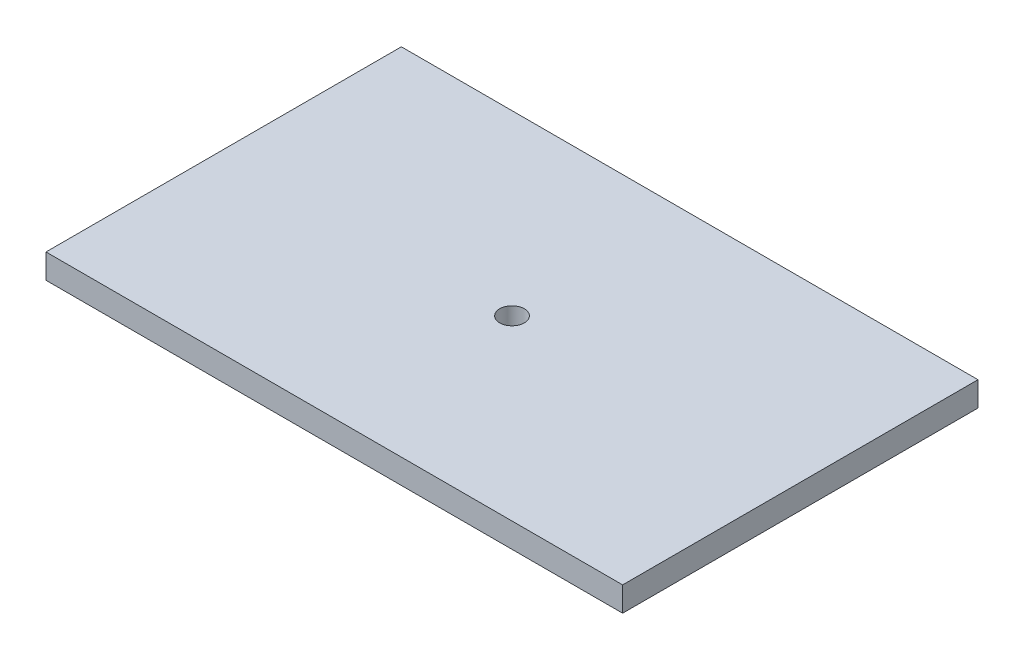
ISO-10303-21;
HEADER;
FILE_DESCRIPTION(('STEP AP214'),'2;1');
FILE_NAME('part.step','',(''),(''),'','','');
FILE_SCHEMA(('AUTOMOTIVE_DESIGN { 1 0 10303 214 1 1 1 1 }'));
ENDSEC;
DATA;
#1=APPLICATION_CONTEXT('core data for automotive mechanical design processes');
#2=APPLICATION_PROTOCOL_DEFINITION('international standard','automotive_design',2000,#1);
#3=PRODUCT_CONTEXT('',#1,'mechanical');
#4=PRODUCT('Part','Part','',(#3));
#5=PRODUCT_RELATED_PRODUCT_CATEGORY('part','',(#4));
#6=PRODUCT_DEFINITION_FORMATION('','',#4);
#7=PRODUCT_DEFINITION_CONTEXT('part definition',#1,'design');
#8=PRODUCT_DEFINITION('design','',#6,#7);
#9=PRODUCT_DEFINITION_SHAPE('','',#8);
#10=(LENGTH_UNIT() NAMED_UNIT(*) SI_UNIT(.MILLI.,.METRE.));
#11=(NAMED_UNIT(*) PLANE_ANGLE_UNIT() SI_UNIT($,.RADIAN.));
#12=(NAMED_UNIT(*) SI_UNIT($,.STERADIAN.) SOLID_ANGLE_UNIT());
#13=UNCERTAINTY_MEASURE_WITH_UNIT(LENGTH_MEASURE(1.E-05),#10,'distance_accuracy_value','');
#14=(GEOMETRIC_REPRESENTATION_CONTEXT(3) GLOBAL_UNCERTAINTY_ASSIGNED_CONTEXT((#13)) GLOBAL_UNIT_ASSIGNED_CONTEXT((#10,
#11,#12)) REPRESENTATION_CONTEXT('',''));
#15=CARTESIAN_POINT('',(0.,0.,0.));
#16=DIRECTION('',(0.,0.,1.));
#17=DIRECTION('',(1.,0.,0.));
#18=AXIS2_PLACEMENT_3D('',#15,#16,#17);
#19=CARTESIAN_POINT('',(117.401060525338,10.,-72.3518163702665));
#20=DIRECTION('',(-1.,0.,0.));
#21=DIRECTION('',(0.,0.,1.));
#22=AXIS2_PLACEMENT_3D('',#19,#20,#21);
#23=PLANE('',#22);
#24=DIRECTION('',(0.,0.,-1.));
#25=VECTOR('',#24,1.);
#26=CARTESIAN_POINT('',(117.401060525338,0.,-72.3518163702665));
#27=LINE('',#26,#25);
#28=CARTESIAN_POINT('',(117.401060525338,0.,72.3518163702665));
#29=VERTEX_POINT('',#28);
#30=CARTESIAN_POINT('',(117.401060525338,0.,-72.3518163702665));
#31=VERTEX_POINT('',#30);
#32=EDGE_CURVE('E96',#29,#31,#27,.T.);
#33=ORIENTED_EDGE('',*,*,#32,.T.);
#34=DIRECTION('',(0.,-1.,0.));
#35=VECTOR('',#34,1.);
#36=CARTESIAN_POINT('',(117.401060525338,10.,-72.3518163702665));
#37=LINE('',#36,#35);
#38=CARTESIAN_POINT('',(117.401060525338,10.,-72.3518163702665));
#39=VERTEX_POINT('',#38);
#40=EDGE_CURVE('E11',#39,#31,#37,.T.);
#41=ORIENTED_EDGE('',*,*,#40,.F.);
#42=DIRECTION('',(0.,0.,-1.));
#43=VECTOR('',#42,1.);
#44=CARTESIAN_POINT('',(117.401060525338,10.,-72.3518163702665));
#45=LINE('',#44,#43);
#46=CARTESIAN_POINT('',(117.401060525338,10.,72.3518163702665));
#47=VERTEX_POINT('',#46);
#48=EDGE_CURVE('E84',#47,#39,#45,.T.);
#49=ORIENTED_EDGE('',*,*,#48,.F.);
#50=DIRECTION('',(0.,-1.,0.));
#51=VECTOR('',#50,1.);
#52=CARTESIAN_POINT('',(117.401060525338,10.,72.3518163702665));
#53=LINE('',#52,#51);
#54=EDGE_CURVE('E92',#47,#29,#53,.T.);
#55=ORIENTED_EDGE('',*,*,#54,.T.);
#56=EDGE_LOOP('',(#33,#41,#49,#55));
#57=FACE_BOUND('',#56,.T.);
#58=ADVANCED_FACE('F33',(#57),#23,.F.);
#59=CARTESIAN_POINT('',(-117.401060525338,10.,-72.3518163702665));
#60=DIRECTION('',(0.,0.,1.));
#61=DIRECTION('',(1.,0.,0.));
#62=AXIS2_PLACEMENT_3D('',#59,#60,#61);
#63=PLANE('',#62);
#64=DIRECTION('',(-1.,0.,0.));
#65=VECTOR('',#64,1.);
#66=CARTESIAN_POINT('',(-117.401060525338,0.,-72.3518163702665));
#67=LINE('',#66,#65);
#68=CARTESIAN_POINT('',(-117.401060525338,0.,-72.3518163702665));
#69=VERTEX_POINT('',#68);
#70=EDGE_CURVE('E88',#31,#69,#67,.T.);
#71=ORIENTED_EDGE('',*,*,#70,.T.);
#72=DIRECTION('',(0.,-1.,0.));
#73=VECTOR('',#72,1.);
#74=CARTESIAN_POINT('',(-117.401060525338,10.,-72.3518163702665));
#75=LINE('',#74,#73);
#76=CARTESIAN_POINT('',(-117.401060525338,10.,-72.3518163702665));
#77=VERTEX_POINT('',#76);
#78=EDGE_CURVE('E41',#77,#69,#75,.T.);
#79=ORIENTED_EDGE('',*,*,#78,.F.);
#80=DIRECTION('',(-1.,0.,0.));
#81=VECTOR('',#80,1.);
#82=CARTESIAN_POINT('',(-117.401060525338,10.,-72.3518163702665));
#83=LINE('',#82,#81);
#84=EDGE_CURVE('E79',#39,#77,#83,.T.);
#85=ORIENTED_EDGE('',*,*,#84,.F.);
#86=ORIENTED_EDGE('',*,*,#40,.T.);
#87=EDGE_LOOP('',(#71,#79,#85,#86));
#88=FACE_BOUND('',#87,.T.);
#89=ADVANCED_FACE('F87',(#88),#63,.F.);
#90=CARTESIAN_POINT('',(-117.401060525338,10.,-72.3518163702665));
#91=DIRECTION('',(1.,0.,0.));
#92=DIRECTION('',(0.,0.,-1.));
#93=AXIS2_PLACEMENT_3D('',#90,#91,#92);
#94=PLANE('',#93);
#95=DIRECTION('',(0.,0.,1.));
#96=VECTOR('',#95,1.);
#97=CARTESIAN_POINT('',(-117.401060525338,0.,-72.3518163702665));
#98=LINE('',#97,#96);
#99=CARTESIAN_POINT('',(-117.401060525338,0.,72.3518163702665));
#100=VERTEX_POINT('',#99);
#101=EDGE_CURVE('E66',#69,#100,#98,.T.);
#102=ORIENTED_EDGE('',*,*,#101,.T.);
#103=DIRECTION('',(0.,-1.,0.));
#104=VECTOR('',#103,1.);
#105=CARTESIAN_POINT('',(-117.401060525338,10.,72.3518163702665));
#106=LINE('',#105,#104);
#107=CARTESIAN_POINT('',(-117.401060525338,10.,72.3518163702665));
#108=VERTEX_POINT('',#107);
#109=EDGE_CURVE('E89',#108,#100,#106,.T.);
#110=ORIENTED_EDGE('',*,*,#109,.F.);
#111=DIRECTION('',(0.,0.,1.));
#112=VECTOR('',#111,1.);
#113=CARTESIAN_POINT('',(-117.401060525338,10.,-72.3518163702665));
#114=LINE('',#113,#112);
#115=EDGE_CURVE('E82',#77,#108,#114,.T.);
#116=ORIENTED_EDGE('',*,*,#115,.F.);
#117=ORIENTED_EDGE('',*,*,#78,.T.);
#118=EDGE_LOOP('',(#102,#110,#116,#117));
#119=FACE_BOUND('',#118,.T.);
#120=ADVANCED_FACE('F90',(#119),#94,.F.);
#121=CARTESIAN_POINT('',(-117.401060525338,10.,72.3518163702665));
#122=DIRECTION('',(0.,0.,-1.));
#123=DIRECTION('',(-1.,0.,0.));
#124=AXIS2_PLACEMENT_3D('',#121,#122,#123);
#125=PLANE('',#124);
#126=DIRECTION('',(1.,0.,0.));
#127=VECTOR('',#126,1.);
#128=CARTESIAN_POINT('',(-117.401060525338,0.,72.3518163702665));
#129=LINE('',#128,#127);
#130=EDGE_CURVE('E72',#100,#29,#129,.T.);
#131=ORIENTED_EDGE('',*,*,#130,.T.);
#132=ORIENTED_EDGE('',*,*,#54,.F.);
#133=DIRECTION('',(1.,0.,0.));
#134=VECTOR('',#133,1.);
#135=CARTESIAN_POINT('',(-117.401060525338,10.,72.3518163702665));
#136=LINE('',#135,#134);
#137=EDGE_CURVE('E49',#108,#47,#136,.T.);
#138=ORIENTED_EDGE('',*,*,#137,.F.);
#139=ORIENTED_EDGE('',*,*,#109,.T.);
#140=EDGE_LOOP('',(#131,#132,#138,#139));
#141=FACE_BOUND('',#140,.T.);
#142=ADVANCED_FACE('F104',(#141),#125,.F.);
#143=CARTESIAN_POINT('',(0.,10.,0.));
#144=DIRECTION('',(0.,1.,0.));
#145=DIRECTION('',(0.,0.,1.));
#146=AXIS2_PLACEMENT_3D('',#143,#144,#145);
#147=PLANE('',#146);
#148=CARTESIAN_POINT('',(0.,10.,0.));
#149=DIRECTION('',(0.,1.,0.));
#150=DIRECTION('',(0.,0.,1.));
#151=AXIS2_PLACEMENT_3D('',#148,#149,#150);
#152=CIRCLE('',#151,5.);
#153=CARTESIAN_POINT('',(0.,10.,5.));
#154=VERTEX_POINT('',#153);
#155=EDGE_CURVE('E110',#154,#154,#152,.T.);
#156=ORIENTED_EDGE('',*,*,#155,.F.);
#157=EDGE_LOOP('',(#156));
#158=FACE_BOUND('',#157,.T.);
#159=ORIENTED_EDGE('',*,*,#48,.T.);
#160=ORIENTED_EDGE('',*,*,#84,.T.);
#161=ORIENTED_EDGE('',*,*,#115,.T.);
#162=ORIENTED_EDGE('',*,*,#137,.T.);
#163=EDGE_LOOP('',(#159,#160,#161,#162));
#164=FACE_BOUND('',#163,.T.);
#165=ADVANCED_FACE('F80',(#158,#164),#147,.T.);
#166=CARTESIAN_POINT('',(0.,0.,0.));
#167=DIRECTION('',(0.,1.,0.));
#168=DIRECTION('',(0.,0.,1.));
#169=AXIS2_PLACEMENT_3D('',#166,#167,#168);
#170=PLANE('',#169);
#171=CARTESIAN_POINT('',(0.,0.,0.));
#172=DIRECTION('',(0.,1.,0.));
#173=DIRECTION('',(0.,0.,1.));
#174=AXIS2_PLACEMENT_3D('',#171,#172,#173);
#175=CIRCLE('',#174,5.);
#176=CARTESIAN_POINT('',(0.,0.,5.));
#177=VERTEX_POINT('',#176);
#178=EDGE_CURVE('E99',#177,#177,#175,.T.);
#179=ORIENTED_EDGE('',*,*,#178,.T.);
#180=EDGE_LOOP('',(#179));
#181=FACE_BOUND('',#180,.T.);
#182=ORIENTED_EDGE('',*,*,#32,.F.);
#183=ORIENTED_EDGE('',*,*,#130,.F.);
#184=ORIENTED_EDGE('',*,*,#101,.F.);
#185=ORIENTED_EDGE('',*,*,#70,.F.);
#186=EDGE_LOOP('',(#182,#183,#184,#185));
#187=FACE_BOUND('',#186,.T.);
#188=ADVANCED_FACE('F107',(#181,#187),#170,.F.);
#189=CARTESIAN_POINT('',(0.,0.,0.));
#190=DIRECTION('',(0.,1.,0.));
#191=DIRECTION('',(0.,0.,1.));
#192=AXIS2_PLACEMENT_3D('',#189,#190,#191);
#193=CYLINDRICAL_SURFACE('',#192,5.);
#194=ORIENTED_EDGE('',*,*,#178,.F.);
#195=EDGE_LOOP('',(#194));
#196=FACE_BOUND('',#195,.T.);
#197=ORIENTED_EDGE('',*,*,#155,.T.);
#198=EDGE_LOOP('',(#197));
#199=FACE_BOUND('',#198,.T.);
#200=ADVANCED_FACE('F117',(#196,#199),#193,.F.);
#201=CLOSED_SHELL('',(#58,#89,#120,#142,#165,#188,#200));
#202=MANIFOLD_SOLID_BREP('B2',#201);
#203=ADVANCED_BREP_SHAPE_REPRESENTATION('',(#18,#202),#14);
#204=SHAPE_DEFINITION_REPRESENTATION(#9,#203);
ENDSEC;
END-ISO-10303-21;
